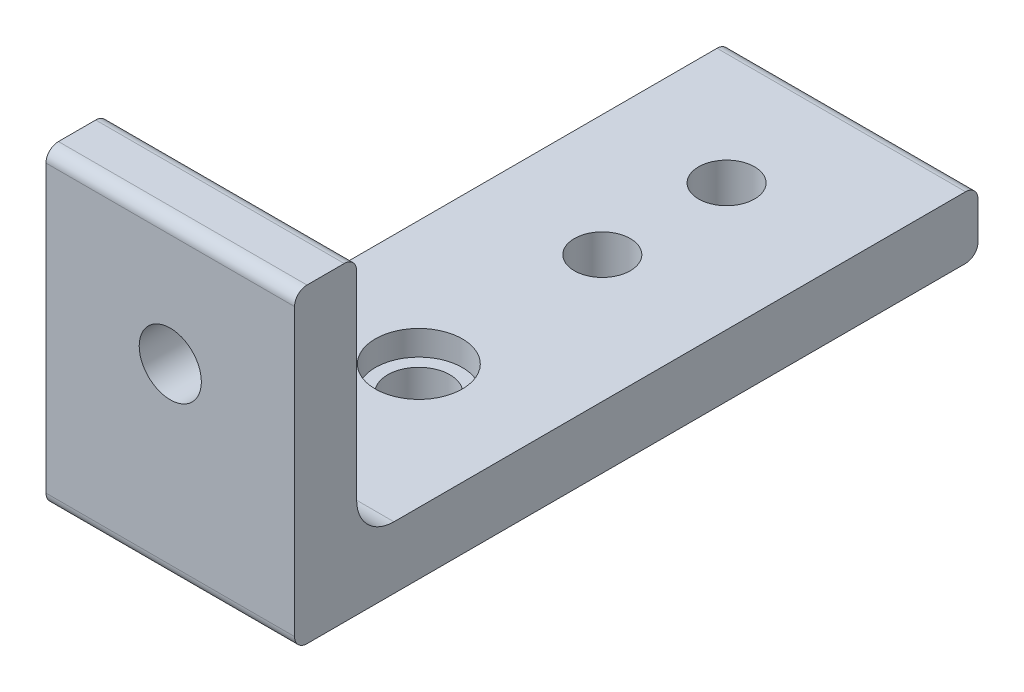
ISO-10303-21;
HEADER;
FILE_DESCRIPTION(('STEP AP214'),'2;1');
FILE_NAME('part.step','',(''),(''),'','','');
FILE_SCHEMA(('AUTOMOTIVE_DESIGN { 1 0 10303 214 1 1 1 1 }'));
ENDSEC;
DATA;
#1=APPLICATION_CONTEXT('core data for automotive mechanical design processes');
#2=APPLICATION_PROTOCOL_DEFINITION('international standard','automotive_design',2000,#1);
#3=PRODUCT_CONTEXT('',#1,'mechanical');
#4=PRODUCT('Part','Part','',(#3));
#5=PRODUCT_RELATED_PRODUCT_CATEGORY('part','',(#4));
#6=PRODUCT_DEFINITION_FORMATION('','',#4);
#7=PRODUCT_DEFINITION_CONTEXT('part definition',#1,'design');
#8=PRODUCT_DEFINITION('design','',#6,#7);
#9=PRODUCT_DEFINITION_SHAPE('','',#8);
#10=(LENGTH_UNIT() NAMED_UNIT(*) SI_UNIT(.MILLI.,.METRE.));
#11=(NAMED_UNIT(*) PLANE_ANGLE_UNIT() SI_UNIT($,.RADIAN.));
#12=(NAMED_UNIT(*) SI_UNIT($,.STERADIAN.) SOLID_ANGLE_UNIT());
#13=UNCERTAINTY_MEASURE_WITH_UNIT(LENGTH_MEASURE(1.E-05),#10,'distance_accuracy_value','');
#14=(GEOMETRIC_REPRESENTATION_CONTEXT(3) GLOBAL_UNCERTAINTY_ASSIGNED_CONTEXT((#13)) GLOBAL_UNIT_ASSIGNED_CONTEXT((#10,
#11,#12)) REPRESENTATION_CONTEXT('',''));
#15=CARTESIAN_POINT('',(0.,0.,0.));
#16=DIRECTION('',(0.,0.,1.));
#17=DIRECTION('',(1.,0.,0.));
#18=AXIS2_PLACEMENT_3D('',#15,#16,#17);
#19=CARTESIAN_POINT('',(10.,-15.,-20.0017965253522));
#20=DIRECTION('',(0.,1.,0.));
#21=DIRECTION('',(0.,0.,1.));
#22=AXIS2_PLACEMENT_3D('',#19,#20,#21);
#23=CYLINDRICAL_SURFACE('',#22,2.5);
#24=CARTESIAN_POINT('',(10.,0.,-20.0017965253522));
#25=DIRECTION('',(0.,1.,0.));
#26=DIRECTION('',(0.,0.,1.));
#27=AXIS2_PLACEMENT_3D('',#24,#25,#26);
#28=CIRCLE('',#27,2.5);
#29=CARTESIAN_POINT('',(10.,0.,-17.5017965253522));
#30=VERTEX_POINT('',#29);
#31=EDGE_CURVE('E356',#30,#30,#28,.T.);
#32=ORIENTED_EDGE('',*,*,#31,.F.);
#33=EDGE_LOOP('',(#32));
#34=FACE_BOUND('',#33,.T.);
#35=CARTESIAN_POINT('',(10.,3.,-20.0017965253522));
#36=DIRECTION('',(0.,1.,0.));
#37=DIRECTION('',(0.,0.,1.));
#38=AXIS2_PLACEMENT_3D('',#35,#36,#37);
#39=CIRCLE('',#38,2.5);
#40=CARTESIAN_POINT('',(10.,3.,-17.5017965253522));
#41=VERTEX_POINT('',#40);
#42=EDGE_CURVE('E46',#41,#41,#39,.F.);
#43=ORIENTED_EDGE('',*,*,#42,.F.);
#44=EDGE_LOOP('',(#43));
#45=FACE_BOUND('',#44,.T.);
#46=ADVANCED_FACE('F42',(#34,#45),#23,.F.);
#47=CARTESIAN_POINT('',(20.,25.,0.));
#48=DIRECTION('',(0.,0.,-1.));
#49=DIRECTION('',(-1.,0.,0.));
#50=AXIS2_PLACEMENT_3D('',#47,#48,#49);
#51=PLANE('',#50);
#52=CARTESIAN_POINT('',(10.,15.,0.));
#53=DIRECTION('',(0.,0.,-1.));
#54=DIRECTION('',(-1.,0.,0.));
#55=AXIS2_PLACEMENT_3D('',#52,#53,#54);
#56=CIRCLE('',#55,2.5);
#57=CARTESIAN_POINT('',(7.5,15.,0.));
#58=VERTEX_POINT('',#57);
#59=EDGE_CURVE('E256',#58,#58,#56,.T.);
#60=ORIENTED_EDGE('',*,*,#59,.T.);
#61=EDGE_LOOP('',(#60));
#62=FACE_BOUND('',#61,.T.);
#63=DIRECTION('',(0.,-1.,0.));
#64=VECTOR('',#63,1.);
#65=CARTESIAN_POINT('',(20.,25.,0.));
#66=LINE('',#65,#64);
#67=CARTESIAN_POINT('',(20.,24.,0.));
#68=VERTEX_POINT('',#67);
#69=CARTESIAN_POINT('',(20.,1.,0.));
#70=VERTEX_POINT('',#69);
#71=EDGE_CURVE('E167',#68,#70,#66,.T.);
#72=ORIENTED_EDGE('',*,*,#71,.F.);
#73=DIRECTION('',(-1.,0.,0.));
#74=VECTOR('',#73,1.);
#75=CARTESIAN_POINT('',(20.,24.,0.));
#76=LINE('',#75,#74);
#77=CARTESIAN_POINT('',(0.,24.,0.));
#78=VERTEX_POINT('',#77);
#79=EDGE_CURVE('E226',#68,#78,#76,.T.);
#80=ORIENTED_EDGE('',*,*,#79,.T.);
#81=DIRECTION('',(0.,-1.,0.));
#82=VECTOR('',#81,1.);
#83=CARTESIAN_POINT('',(0.,25.,0.));
#84=LINE('',#83,#82);
#85=CARTESIAN_POINT('',(0.,1.,0.));
#86=VERTEX_POINT('',#85);
#87=EDGE_CURVE('E259',#78,#86,#84,.T.);
#88=ORIENTED_EDGE('',*,*,#87,.T.);
#89=DIRECTION('',(-1.,0.,0.));
#90=VECTOR('',#89,1.);
#91=CARTESIAN_POINT('',(20.,1.,0.));
#92=LINE('',#91,#90);
#93=EDGE_CURVE('E223',#86,#70,#92,.F.);
#94=ORIENTED_EDGE('',*,*,#93,.T.);
#95=EDGE_LOOP('',(#72,#80,#88,#94));
#96=FACE_BOUND('',#95,.T.);
#97=ADVANCED_FACE('F291',(#62,#96),#51,.F.);
#98=CARTESIAN_POINT('',(20.,0.,0.));
#99=DIRECTION('',(0.,1.,0.));
#100=DIRECTION('',(0.,0.,1.));
#101=AXIS2_PLACEMENT_3D('',#98,#99,#100);
#102=PLANE('',#101);
#103=CARTESIAN_POINT('',(9.76785234641802,0.,-45.));
#104=DIRECTION('',(0.,1.,0.));
#105=DIRECTION('',(0.,0.,1.));
#106=AXIS2_PLACEMENT_3D('',#103,#104,#105);
#107=CIRCLE('',#106,2.25);
#108=CARTESIAN_POINT('',(9.76785234641802,0.,-42.75));
#109=VERTEX_POINT('',#108);
#110=EDGE_CURVE('E350',#109,#109,#107,.T.);
#111=ORIENTED_EDGE('',*,*,#110,.T.);
#112=EDGE_LOOP('',(#111));
#113=FACE_BOUND('',#112,.T.);
#114=CARTESIAN_POINT('',(9.76785234641802,0.,-35.));
#115=DIRECTION('',(0.,1.,0.));
#116=DIRECTION('',(0.,0.,1.));
#117=AXIS2_PLACEMENT_3D('',#114,#115,#116);
#118=CIRCLE('',#117,2.25);
#119=CARTESIAN_POINT('',(9.76785234641802,0.,-32.75));
#120=VERTEX_POINT('',#119);
#121=EDGE_CURVE('E354',#120,#120,#118,.T.);
#122=ORIENTED_EDGE('',*,*,#121,.T.);
#123=EDGE_LOOP('',(#122));
#124=FACE_BOUND('',#123,.T.);
#125=ORIENTED_EDGE('',*,*,#31,.T.);
#126=EDGE_LOOP('',(#125));
#127=FACE_BOUND('',#126,.T.);
#128=DIRECTION('',(0.,0.,-1.));
#129=VECTOR('',#128,1.);
#130=CARTESIAN_POINT('',(0.,0.,0.));
#131=LINE('',#130,#129);
#132=CARTESIAN_POINT('',(0.,0.,-1.));
#133=VERTEX_POINT('',#132);
#134=CARTESIAN_POINT('',(0.,0.,-54.));
#135=VERTEX_POINT('',#134);
#136=EDGE_CURVE('E263',#133,#135,#131,.T.);
#137=ORIENTED_EDGE('',*,*,#136,.T.);
#138=DIRECTION('',(-1.,0.,0.));
#139=VECTOR('',#138,1.);
#140=CARTESIAN_POINT('',(20.,0.,-54.));
#141=LINE('',#140,#139);
#142=CARTESIAN_POINT('',(20.,0.,-54.));
#143=VERTEX_POINT('',#142);
#144=EDGE_CURVE('E202',#135,#143,#141,.F.);
#145=ORIENTED_EDGE('',*,*,#144,.T.);
#146=DIRECTION('',(0.,0.,-1.));
#147=VECTOR('',#146,1.);
#148=CARTESIAN_POINT('',(20.,0.,0.));
#149=LINE('',#148,#147);
#150=CARTESIAN_POINT('',(20.,0.,-1.));
#151=VERTEX_POINT('',#150);
#152=EDGE_CURVE('E246',#151,#143,#149,.T.);
#153=ORIENTED_EDGE('',*,*,#152,.F.);
#154=DIRECTION('',(-1.,0.,0.));
#155=VECTOR('',#154,1.);
#156=CARTESIAN_POINT('',(20.,0.,-1.));
#157=LINE('',#156,#155);
#158=EDGE_CURVE('E198',#151,#133,#157,.T.);
#159=ORIENTED_EDGE('',*,*,#158,.T.);
#160=EDGE_LOOP('',(#137,#145,#153,#159));
#161=FACE_BOUND('',#160,.T.);
#162=ADVANCED_FACE('F298',(#113,#124,#127,#161),#102,.F.);
#163=CARTESIAN_POINT('',(20.,0.,-55.));
#164=DIRECTION('',(0.,0.,1.));
#165=DIRECTION('',(1.,0.,0.));
#166=AXIS2_PLACEMENT_3D('',#163,#164,#165);
#167=PLANE('',#166);
#168=DIRECTION('',(0.,1.,0.));
#169=VECTOR('',#168,1.);
#170=CARTESIAN_POINT('',(20.,0.,-55.));
#171=LINE('',#170,#169);
#172=CARTESIAN_POINT('',(20.,1.,-55.));
#173=VERTEX_POINT('',#172);
#174=CARTESIAN_POINT('',(20.,4.,-55.));
#175=VERTEX_POINT('',#174);
#176=EDGE_CURVE('E242',#173,#175,#171,.T.);
#177=ORIENTED_EDGE('',*,*,#176,.F.);
#178=DIRECTION('',(-1.,0.,0.));
#179=VECTOR('',#178,1.);
#180=CARTESIAN_POINT('',(20.,1.,-55.));
#181=LINE('',#180,#179);
#182=CARTESIAN_POINT('',(0.,1.,-55.));
#183=VERTEX_POINT('',#182);
#184=EDGE_CURVE('E180',#173,#183,#181,.T.);
#185=ORIENTED_EDGE('',*,*,#184,.T.);
#186=DIRECTION('',(0.,1.,0.));
#187=VECTOR('',#186,1.);
#188=CARTESIAN_POINT('',(0.,0.,-55.));
#189=LINE('',#188,#187);
#190=CARTESIAN_POINT('',(0.,4.,-55.));
#191=VERTEX_POINT('',#190);
#192=EDGE_CURVE('E169',#183,#191,#189,.T.);
#193=ORIENTED_EDGE('',*,*,#192,.T.);
#194=DIRECTION('',(-1.,0.,0.));
#195=VECTOR('',#194,1.);
#196=CARTESIAN_POINT('',(20.,4.,-55.));
#197=LINE('',#196,#195);
#198=EDGE_CURVE('E177',#191,#175,#197,.F.);
#199=ORIENTED_EDGE('',*,*,#198,.T.);
#200=EDGE_LOOP('',(#177,#185,#193,#199));
#201=FACE_BOUND('',#200,.T.);
#202=ADVANCED_FACE('F271',(#201),#167,.F.);
#203=CARTESIAN_POINT('',(20.,5.,-5.));
#204=DIRECTION('',(0.,-1.,0.));
#205=DIRECTION('',(0.,0.,-1.));
#206=AXIS2_PLACEMENT_3D('',#203,#204,#205);
#207=PLANE('',#206);
#208=CARTESIAN_POINT('',(10.,5.,-20.0017965253522));
#209=DIRECTION('',(0.,1.,0.));
#210=DIRECTION('',(0.,0.,1.));
#211=AXIS2_PLACEMENT_3D('',#208,#209,#210);
#212=CIRCLE('',#211,3.5);
#213=CARTESIAN_POINT('',(10.,5.,-16.5017965253522));
#214=VERTEX_POINT('',#213);
#215=EDGE_CURVE('E380',#214,#214,#212,.T.);
#216=ORIENTED_EDGE('',*,*,#215,.F.);
#217=EDGE_LOOP('',(#216));
#218=FACE_BOUND('',#217,.T.);
#219=CARTESIAN_POINT('',(9.76785234641802,5.,-45.));
#220=DIRECTION('',(0.,1.,0.));
#221=DIRECTION('',(0.,0.,1.));
#222=AXIS2_PLACEMENT_3D('',#219,#220,#221);
#223=CIRCLE('',#222,2.25);
#224=CARTESIAN_POINT('',(9.76785234641802,5.,-42.75));
#225=VERTEX_POINT('',#224);
#226=EDGE_CURVE('E358',#225,#225,#223,.T.);
#227=ORIENTED_EDGE('',*,*,#226,.F.);
#228=EDGE_LOOP('',(#227));
#229=FACE_BOUND('',#228,.T.);
#230=CARTESIAN_POINT('',(9.76785234641802,5.,-35.));
#231=DIRECTION('',(0.,1.,0.));
#232=DIRECTION('',(0.,0.,1.));
#233=AXIS2_PLACEMENT_3D('',#230,#231,#232);
#234=CIRCLE('',#233,2.25);
#235=CARTESIAN_POINT('',(9.76785234641802,5.,-32.75));
#236=VERTEX_POINT('',#235);
#237=EDGE_CURVE('E364',#236,#236,#234,.T.);
#238=ORIENTED_EDGE('',*,*,#237,.F.);
#239=EDGE_LOOP('',(#238));
#240=FACE_BOUND('',#239,.T.);
#241=DIRECTION('',(0.,0.,1.));
#242=VECTOR('',#241,1.);
#243=CARTESIAN_POINT('',(20.,5.,-5.));
#244=LINE('',#243,#242);
#245=CARTESIAN_POINT('',(20.,5.,-54.));
#246=VERTEX_POINT('',#245);
#247=CARTESIAN_POINT('',(20.,5.,-8.));
#248=VERTEX_POINT('',#247);
#249=EDGE_CURVE('E239',#246,#248,#244,.T.);
#250=ORIENTED_EDGE('',*,*,#249,.F.);
#251=DIRECTION('',(-1.,0.,0.));
#252=VECTOR('',#251,1.);
#253=CARTESIAN_POINT('',(20.,5.,-54.));
#254=LINE('',#253,#252);
#255=CARTESIAN_POINT('',(0.,5.,-54.));
#256=VERTEX_POINT('',#255);
#257=EDGE_CURVE('E219',#246,#256,#254,.T.);
#258=ORIENTED_EDGE('',*,*,#257,.T.);
#259=DIRECTION('',(0.,0.,1.));
#260=VECTOR('',#259,1.);
#261=CARTESIAN_POINT('',(0.,5.,-5.));
#262=LINE('',#261,#260);
#263=CARTESIAN_POINT('',(0.,5.,-8.));
#264=VERTEX_POINT('',#263);
#265=EDGE_CURVE('E163',#256,#264,#262,.T.);
#266=ORIENTED_EDGE('',*,*,#265,.T.);
#267=DIRECTION('',(-1.,0.,0.));
#268=VECTOR('',#267,1.);
#269=CARTESIAN_POINT('',(20.,5.,-8.));
#270=LINE('',#269,#268);
#271=EDGE_CURVE('E140',#264,#248,#270,.F.);
#272=ORIENTED_EDGE('',*,*,#271,.T.);
#273=EDGE_LOOP('',(#250,#258,#266,#272));
#274=FACE_BOUND('',#273,.T.);
#275=ADVANCED_FACE('F280',(#218,#229,#240,#274),#207,.F.);
#276=CARTESIAN_POINT('',(20.,25.,-5.));
#277=DIRECTION('',(0.,0.,1.));
#278=DIRECTION('',(0.,-1.,0.));
#279=AXIS2_PLACEMENT_3D('',#276,#277,#278);
#280=PLANE('',#279);
#281=CARTESIAN_POINT('',(10.,15.,-5.));
#282=DIRECTION('',(0.,0.,-1.));
#283=DIRECTION('',(0.,1.,0.));
#284=AXIS2_PLACEMENT_3D('',#281,#282,#283);
#285=CIRCLE('',#284,2.5);
#286=CARTESIAN_POINT('',(10.,17.5,-5.));
#287=VERTEX_POINT('',#286);
#288=EDGE_CURVE('E369',#287,#287,#285,.T.);
#289=ORIENTED_EDGE('',*,*,#288,.F.);
#290=EDGE_LOOP('',(#289));
#291=FACE_BOUND('',#290,.T.);
#292=DIRECTION('',(0.,1.,0.));
#293=VECTOR('',#292,1.);
#294=CARTESIAN_POINT('',(0.,25.,-5.));
#295=LINE('',#294,#293);
#296=CARTESIAN_POINT('',(0.,8.00000000000001,-5.));
#297=VERTEX_POINT('',#296);
#298=CARTESIAN_POINT('',(0.,24.,-5.));
#299=VERTEX_POINT('',#298);
#300=EDGE_CURVE('E151',#297,#299,#295,.T.);
#301=ORIENTED_EDGE('',*,*,#300,.T.);
#302=DIRECTION('',(-1.,0.,0.));
#303=VECTOR('',#302,1.);
#304=CARTESIAN_POINT('',(20.,24.,-5.));
#305=LINE('',#304,#303);
#306=CARTESIAN_POINT('',(20.,24.,-5.));
#307=VERTEX_POINT('',#306);
#308=EDGE_CURVE('E11',#299,#307,#305,.F.);
#309=ORIENTED_EDGE('',*,*,#308,.T.);
#310=DIRECTION('',(0.,1.,0.));
#311=VECTOR('',#310,1.);
#312=CARTESIAN_POINT('',(20.,25.,-5.));
#313=LINE('',#312,#311);
#314=CARTESIAN_POINT('',(20.,8.00000000000001,-5.));
#315=VERTEX_POINT('',#314);
#316=EDGE_CURVE('E153',#315,#307,#313,.T.);
#317=ORIENTED_EDGE('',*,*,#316,.F.);
#318=DIRECTION('',(-1.,0.,0.));
#319=VECTOR('',#318,1.);
#320=CARTESIAN_POINT('',(0.,8.,-5.));
#321=LINE('',#320,#319);
#322=EDGE_CURVE('E138',#315,#297,#321,.T.);
#323=ORIENTED_EDGE('',*,*,#322,.T.);
#324=EDGE_LOOP('',(#301,#309,#317,#323));
#325=FACE_BOUND('',#324,.T.);
#326=ADVANCED_FACE('F150',(#291,#325),#280,.F.);
#327=CARTESIAN_POINT('',(20.,25.,-5.));
#328=DIRECTION('',(0.,-1.,0.));
#329=DIRECTION('',(0.,0.,-1.));
#330=AXIS2_PLACEMENT_3D('',#327,#328,#329);
#331=PLANE('',#330);
#332=DIRECTION('',(0.,0.,1.));
#333=VECTOR('',#332,1.);
#334=CARTESIAN_POINT('',(0.,25.,-5.));
#335=LINE('',#334,#333);
#336=CARTESIAN_POINT('',(0.,25.,-3.99999999999999));
#337=VERTEX_POINT('',#336);
#338=CARTESIAN_POINT('',(0.,25.,-0.999999999999997));
#339=VERTEX_POINT('',#338);
#340=EDGE_CURVE('E162',#337,#339,#335,.T.);
#341=ORIENTED_EDGE('',*,*,#340,.T.);
#342=DIRECTION('',(-1.,0.,0.));
#343=VECTOR('',#342,1.);
#344=CARTESIAN_POINT('',(20.,25.,-0.999999999999997));
#345=LINE('',#344,#343);
#346=CARTESIAN_POINT('',(20.,25.,-0.999999999999997));
#347=VERTEX_POINT('',#346);
#348=EDGE_CURVE('E52',#339,#347,#345,.F.);
#349=ORIENTED_EDGE('',*,*,#348,.T.);
#350=DIRECTION('',(0.,0.,1.));
#351=VECTOR('',#350,1.);
#352=CARTESIAN_POINT('',(20.,25.,-5.));
#353=LINE('',#352,#351);
#354=CARTESIAN_POINT('',(20.,25.,-3.99999999999999));
#355=VERTEX_POINT('',#354);
#356=EDGE_CURVE('E155',#355,#347,#353,.T.);
#357=ORIENTED_EDGE('',*,*,#356,.F.);
#358=DIRECTION('',(-1.,0.,0.));
#359=VECTOR('',#358,1.);
#360=CARTESIAN_POINT('',(20.,25.,-3.99999999999999));
#361=LINE('',#360,#359);
#362=EDGE_CURVE('E230',#355,#337,#361,.T.);
#363=ORIENTED_EDGE('',*,*,#362,.T.);
#364=EDGE_LOOP('',(#341,#349,#357,#363));
#365=FACE_BOUND('',#364,.T.);
#366=ADVANCED_FACE('F284',(#365),#331,.F.);
#367=CARTESIAN_POINT('',(20.,0.,0.));
#368=DIRECTION('',(1.,0.,0.));
#369=DIRECTION('',(0.,0.,-1.));
#370=AXIS2_PLACEMENT_3D('',#367,#368,#369);
#371=PLANE('',#370);
#372=ORIENTED_EDGE('',*,*,#152,.T.);
#373=CARTESIAN_POINT('',(20.,1.,-54.));
#374=DIRECTION('',(1.,0.,0.));
#375=DIRECTION('',(0.,0.,-1.));
#376=AXIS2_PLACEMENT_3D('',#373,#374,#375);
#377=CIRCLE('',#376,1.);
#378=EDGE_CURVE('E216',#143,#173,#377,.T.);
#379=ORIENTED_EDGE('',*,*,#378,.T.);
#380=ORIENTED_EDGE('',*,*,#176,.T.);
#381=CARTESIAN_POINT('',(20.,4.,-54.));
#382=DIRECTION('',(1.,0.,0.));
#383=DIRECTION('',(0.,0.,-1.));
#384=AXIS2_PLACEMENT_3D('',#381,#382,#383);
#385=CIRCLE('',#384,1.);
#386=EDGE_CURVE('E213',#175,#246,#385,.T.);
#387=ORIENTED_EDGE('',*,*,#386,.T.);
#388=ORIENTED_EDGE('',*,*,#249,.T.);
#389=CARTESIAN_POINT('',(20.,8.,-8.));
#390=DIRECTION('',(1.,0.,0.));
#391=DIRECTION('',(0.,0.,-1.));
#392=AXIS2_PLACEMENT_3D('',#389,#390,#391);
#393=CIRCLE('',#392,3.);
#394=EDGE_CURVE('E145',#248,#315,#393,.F.);
#395=ORIENTED_EDGE('',*,*,#394,.T.);
#396=ORIENTED_EDGE('',*,*,#316,.T.);
#397=CARTESIAN_POINT('',(20.,24.,-4.));
#398=DIRECTION('',(1.,0.,0.));
#399=DIRECTION('',(0.,0.,-1.));
#400=AXIS2_PLACEMENT_3D('',#397,#398,#399);
#401=CIRCLE('',#400,1.);
#402=EDGE_CURVE('E65',#307,#355,#401,.T.);
#403=ORIENTED_EDGE('',*,*,#402,.T.);
#404=ORIENTED_EDGE('',*,*,#356,.T.);
#405=CARTESIAN_POINT('',(20.,24.,-1.));
#406=DIRECTION('',(1.,0.,0.));
#407=DIRECTION('',(0.,0.,-1.));
#408=AXIS2_PLACEMENT_3D('',#405,#406,#407);
#409=CIRCLE('',#408,1.);
#410=EDGE_CURVE('E210',#347,#68,#409,.T.);
#411=ORIENTED_EDGE('',*,*,#410,.T.);
#412=ORIENTED_EDGE('',*,*,#71,.T.);
#413=CARTESIAN_POINT('',(20.,1.,-1.));
#414=DIRECTION('',(1.,0.,0.));
#415=DIRECTION('',(0.,0.,-1.));
#416=AXIS2_PLACEMENT_3D('',#413,#414,#415);
#417=CIRCLE('',#416,1.);
#418=EDGE_CURVE('E205',#70,#151,#417,.T.);
#419=ORIENTED_EDGE('',*,*,#418,.T.);
#420=EDGE_LOOP('',(#372,#379,#380,#387,#388,#395,#396,#403,#404,#411,#412,#419));
#421=FACE_BOUND('',#420,.T.);
#422=ADVANCED_FACE('F278',(#421),#371,.T.);
#423=CARTESIAN_POINT('',(0.,0.,0.));
#424=DIRECTION('',(1.,0.,0.));
#425=DIRECTION('',(0.,0.,-1.));
#426=AXIS2_PLACEMENT_3D('',#423,#424,#425);
#427=PLANE('',#426);
#428=ORIENTED_EDGE('',*,*,#192,.F.);
#429=CARTESIAN_POINT('',(0.,1.,-54.));
#430=DIRECTION('',(1.,0.,0.));
#431=DIRECTION('',(0.,0.,-1.));
#432=AXIS2_PLACEMENT_3D('',#429,#430,#431);
#433=CIRCLE('',#432,1.);
#434=EDGE_CURVE('E195',#183,#135,#433,.F.);
#435=ORIENTED_EDGE('',*,*,#434,.T.);
#436=ORIENTED_EDGE('',*,*,#136,.F.);
#437=CARTESIAN_POINT('',(0.,1.,-1.));
#438=DIRECTION('',(1.,0.,0.));
#439=DIRECTION('',(0.,0.,-1.));
#440=AXIS2_PLACEMENT_3D('',#437,#438,#439);
#441=CIRCLE('',#440,1.);
#442=EDGE_CURVE('E184',#133,#86,#441,.F.);
#443=ORIENTED_EDGE('',*,*,#442,.T.);
#444=ORIENTED_EDGE('',*,*,#87,.F.);
#445=CARTESIAN_POINT('',(0.,24.,-1.));
#446=DIRECTION('',(1.,0.,0.));
#447=DIRECTION('',(0.,0.,-1.));
#448=AXIS2_PLACEMENT_3D('',#445,#446,#447);
#449=CIRCLE('',#448,1.);
#450=EDGE_CURVE('E189',#78,#339,#449,.F.);
#451=ORIENTED_EDGE('',*,*,#450,.T.);
#452=ORIENTED_EDGE('',*,*,#340,.F.);
#453=CARTESIAN_POINT('',(0.,24.,-4.));
#454=DIRECTION('',(1.,0.,0.));
#455=DIRECTION('',(0.,0.,-1.));
#456=AXIS2_PLACEMENT_3D('',#453,#454,#455);
#457=CIRCLE('',#456,1.);
#458=EDGE_CURVE('E160',#337,#299,#457,.F.);
#459=ORIENTED_EDGE('',*,*,#458,.T.);
#460=ORIENTED_EDGE('',*,*,#300,.F.);
#461=CARTESIAN_POINT('',(0.,8.,-8.));
#462=DIRECTION('',(1.,0.,0.));
#463=DIRECTION('',(0.,0.,-1.));
#464=AXIS2_PLACEMENT_3D('',#461,#462,#463);
#465=CIRCLE('',#464,3.);
#466=EDGE_CURVE('E134',#297,#264,#465,.T.);
#467=ORIENTED_EDGE('',*,*,#466,.T.);
#468=ORIENTED_EDGE('',*,*,#265,.F.);
#469=CARTESIAN_POINT('',(0.,4.,-54.));
#470=DIRECTION('',(1.,0.,0.));
#471=DIRECTION('',(0.,0.,-1.));
#472=AXIS2_PLACEMENT_3D('',#469,#470,#471);
#473=CIRCLE('',#472,1.);
#474=EDGE_CURVE('E192',#256,#191,#473,.F.);
#475=ORIENTED_EDGE('',*,*,#474,.T.);
#476=EDGE_LOOP('',(#428,#435,#436,#443,#444,#451,#452,#459,#460,#467,#468,#475));
#477=FACE_BOUND('',#476,.T.);
#478=ADVANCED_FACE('F158',(#477),#427,.F.);
#479=CARTESIAN_POINT('',(20.,8.,-8.));
#480=DIRECTION('',(1.,0.,0.));
#481=DIRECTION('',(0.,0.,-1.));
#482=AXIS2_PLACEMENT_3D('',#479,#480,#481);
#483=CYLINDRICAL_SURFACE('',#482,3.);
#484=ORIENTED_EDGE('',*,*,#394,.F.);
#485=ORIENTED_EDGE('',*,*,#271,.F.);
#486=ORIENTED_EDGE('',*,*,#466,.F.);
#487=ORIENTED_EDGE('',*,*,#322,.F.);
#488=EDGE_LOOP('',(#484,#485,#486,#487));
#489=FACE_BOUND('',#488,.T.);
#490=ADVANCED_FACE('F137',(#489),#483,.F.);
#491=CARTESIAN_POINT('',(20.,1.,-54.));
#492=DIRECTION('',(-1.,0.,0.));
#493=DIRECTION('',(0.,0.,1.));
#494=AXIS2_PLACEMENT_3D('',#491,#492,#493);
#495=CYLINDRICAL_SURFACE('',#494,1.);
#496=ORIENTED_EDGE('',*,*,#378,.F.);
#497=ORIENTED_EDGE('',*,*,#144,.F.);
#498=ORIENTED_EDGE('',*,*,#434,.F.);
#499=ORIENTED_EDGE('',*,*,#184,.F.);
#500=EDGE_LOOP('',(#496,#497,#498,#499));
#501=FACE_BOUND('',#500,.T.);
#502=ADVANCED_FACE('F302',(#501),#495,.T.);
#503=CARTESIAN_POINT('',(20.,4.,-54.));
#504=DIRECTION('',(-1.,0.,0.));
#505=DIRECTION('',(0.,0.,1.));
#506=AXIS2_PLACEMENT_3D('',#503,#504,#505);
#507=CYLINDRICAL_SURFACE('',#506,1.);
#508=ORIENTED_EDGE('',*,*,#386,.F.);
#509=ORIENTED_EDGE('',*,*,#198,.F.);
#510=ORIENTED_EDGE('',*,*,#474,.F.);
#511=ORIENTED_EDGE('',*,*,#257,.F.);
#512=EDGE_LOOP('',(#508,#509,#510,#511));
#513=FACE_BOUND('',#512,.T.);
#514=ADVANCED_FACE('F275',(#513),#507,.T.);
#515=CARTESIAN_POINT('',(20.,24.,-1.));
#516=DIRECTION('',(-1.,0.,0.));
#517=DIRECTION('',(0.,0.,1.));
#518=AXIS2_PLACEMENT_3D('',#515,#516,#517);
#519=CYLINDRICAL_SURFACE('',#518,1.);
#520=ORIENTED_EDGE('',*,*,#410,.F.);
#521=ORIENTED_EDGE('',*,*,#348,.F.);
#522=ORIENTED_EDGE('',*,*,#450,.F.);
#523=ORIENTED_EDGE('',*,*,#79,.F.);
#524=EDGE_LOOP('',(#520,#521,#522,#523));
#525=FACE_BOUND('',#524,.T.);
#526=ADVANCED_FACE('F289',(#525),#519,.T.);
#527=CARTESIAN_POINT('',(20.,24.,-4.));
#528=DIRECTION('',(-1.,0.,0.));
#529=DIRECTION('',(0.,0.,1.));
#530=AXIS2_PLACEMENT_3D('',#527,#528,#529);
#531=CYLINDRICAL_SURFACE('',#530,1.);
#532=ORIENTED_EDGE('',*,*,#402,.F.);
#533=ORIENTED_EDGE('',*,*,#308,.F.);
#534=ORIENTED_EDGE('',*,*,#458,.F.);
#535=ORIENTED_EDGE('',*,*,#362,.F.);
#536=EDGE_LOOP('',(#532,#533,#534,#535));
#537=FACE_BOUND('',#536,.T.);
#538=ADVANCED_FACE('F283',(#537),#531,.T.);
#539=CARTESIAN_POINT('',(20.,1.,-1.));
#540=DIRECTION('',(-1.,0.,0.));
#541=DIRECTION('',(0.,0.,1.));
#542=AXIS2_PLACEMENT_3D('',#539,#540,#541);
#543=CYLINDRICAL_SURFACE('',#542,1.);
#544=ORIENTED_EDGE('',*,*,#418,.F.);
#545=ORIENTED_EDGE('',*,*,#93,.F.);
#546=ORIENTED_EDGE('',*,*,#442,.F.);
#547=ORIENTED_EDGE('',*,*,#158,.F.);
#548=EDGE_LOOP('',(#544,#545,#546,#547));
#549=FACE_BOUND('',#548,.T.);
#550=ADVANCED_FACE('F44',(#549),#543,.T.);
#551=CARTESIAN_POINT('',(10.,15.,15.));
#552=DIRECTION('',(0.,0.,-1.));
#553=DIRECTION('',(0.,1.,0.));
#554=AXIS2_PLACEMENT_3D('',#551,#552,#553);
#555=CYLINDRICAL_SURFACE('',#554,2.5);
#556=ORIENTED_EDGE('',*,*,#288,.T.);
#557=EDGE_LOOP('',(#556));
#558=FACE_BOUND('',#557,.T.);
#559=ORIENTED_EDGE('',*,*,#59,.F.);
#560=EDGE_LOOP('',(#559));
#561=FACE_BOUND('',#560,.T.);
#562=ADVANCED_FACE('F325',(#558,#561),#555,.F.);
#563=CARTESIAN_POINT('',(9.76785234641802,-15.,-35.));
#564=DIRECTION('',(0.,1.,0.));
#565=DIRECTION('',(0.,0.,1.));
#566=AXIS2_PLACEMENT_3D('',#563,#564,#565);
#567=CYLINDRICAL_SURFACE('',#566,2.25);
#568=ORIENTED_EDGE('',*,*,#237,.T.);
#569=EDGE_LOOP('',(#568));
#570=FACE_BOUND('',#569,.T.);
#571=ORIENTED_EDGE('',*,*,#121,.F.);
#572=EDGE_LOOP('',(#571));
#573=FACE_BOUND('',#572,.T.);
#574=ADVANCED_FACE('F323',(#570,#573),#567,.F.);
#575=CARTESIAN_POINT('',(9.76785234641802,-15.,-45.));
#576=DIRECTION('',(0.,1.,0.));
#577=DIRECTION('',(0.,0.,1.));
#578=AXIS2_PLACEMENT_3D('',#575,#576,#577);
#579=CYLINDRICAL_SURFACE('',#578,2.25);
#580=ORIENTED_EDGE('',*,*,#226,.T.);
#581=EDGE_LOOP('',(#580));
#582=FACE_BOUND('',#581,.T.);
#583=ORIENTED_EDGE('',*,*,#110,.F.);
#584=EDGE_LOOP('',(#583));
#585=FACE_BOUND('',#584,.T.);
#586=ADVANCED_FACE('F396',(#582,#585),#579,.F.);
#587=CARTESIAN_POINT('',(10.,3.,-20.0017965253522));
#588=DIRECTION('',(0.,1.,0.));
#589=DIRECTION('',(0.,0.,1.));
#590=AXIS2_PLACEMENT_3D('',#587,#588,#589);
#591=PLANE('',#590);
#592=CARTESIAN_POINT('',(10.,3.,-20.0017965253522));
#593=DIRECTION('',(0.,1.,0.));
#594=DIRECTION('',(0.,0.,1.));
#595=AXIS2_PLACEMENT_3D('',#592,#593,#594);
#596=CIRCLE('',#595,3.5);
#597=CARTESIAN_POINT('',(10.,3.,-16.5017965253522));
#598=VERTEX_POINT('',#597);
#599=EDGE_CURVE('E384',#598,#598,#596,.T.);
#600=ORIENTED_EDGE('',*,*,#599,.T.);
#601=EDGE_LOOP('',(#600));
#602=FACE_BOUND('',#601,.T.);
#603=ORIENTED_EDGE('',*,*,#42,.T.);
#604=EDGE_LOOP('',(#603));
#605=FACE_BOUND('',#604,.T.);
#606=ADVANCED_FACE('F393',(#602,#605),#591,.T.);
#607=CARTESIAN_POINT('',(10.,3.,-20.0017965253522));
#608=DIRECTION('',(0.,1.,0.));
#609=DIRECTION('',(0.,0.,1.));
#610=AXIS2_PLACEMENT_3D('',#607,#608,#609);
#611=CYLINDRICAL_SURFACE('',#610,3.5);
#612=ORIENTED_EDGE('',*,*,#599,.F.);
#613=EDGE_LOOP('',(#612));
#614=FACE_BOUND('',#613,.T.);
#615=ORIENTED_EDGE('',*,*,#215,.T.);
#616=EDGE_LOOP('',(#615));
#617=FACE_BOUND('',#616,.T.);
#618=ADVANCED_FACE('F395',(#614,#617),#611,.F.);
#619=CLOSED_SHELL('',(#46,#97,#162,#202,#275,#326,#366,#422,#478,#490,#502,#514,#526,#538,#550,
#562,#574,#586,#606,#618));
#620=MANIFOLD_SOLID_BREP('B2',#619);
#621=ADVANCED_BREP_SHAPE_REPRESENTATION('',(#18,#620),#14);
#622=SHAPE_DEFINITION_REPRESENTATION(#9,#621);
ENDSEC;
END-ISO-10303-21;
